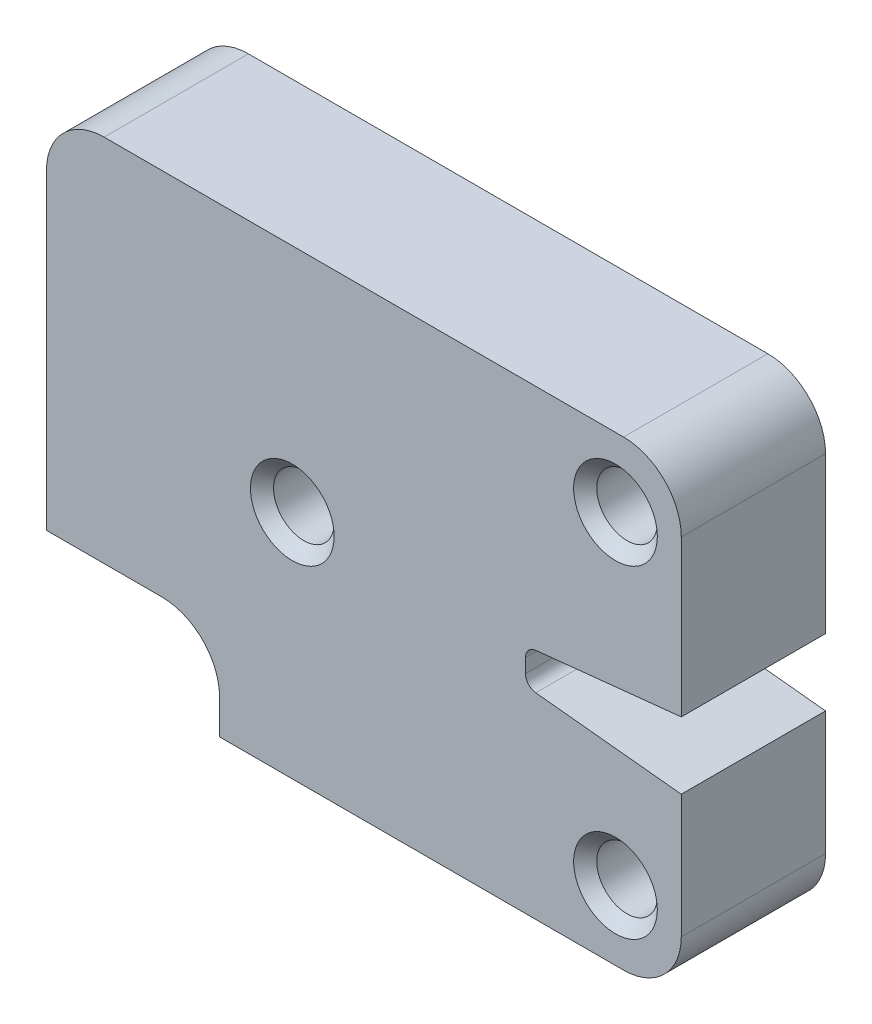
ISO-10303-21;
HEADER;
FILE_DESCRIPTION(('STEP AP214'),'2;1');
FILE_NAME('part.step','',(''),(''),'','','');
FILE_SCHEMA(('AUTOMOTIVE_DESIGN { 1 0 10303 214 1 1 1 1 }'));
ENDSEC;
DATA;
#1=APPLICATION_CONTEXT('core data for automotive mechanical design processes');
#2=APPLICATION_PROTOCOL_DEFINITION('international standard','automotive_design',2000,#1);
#3=PRODUCT_CONTEXT('',#1,'mechanical');
#4=PRODUCT('Part','Part','',(#3));
#5=PRODUCT_RELATED_PRODUCT_CATEGORY('part','',(#4));
#6=PRODUCT_DEFINITION_FORMATION('','',#4);
#7=PRODUCT_DEFINITION_CONTEXT('part definition',#1,'design');
#8=PRODUCT_DEFINITION('design','',#6,#7);
#9=PRODUCT_DEFINITION_SHAPE('','',#8);
#10=(LENGTH_UNIT() NAMED_UNIT(*) SI_UNIT(.MILLI.,.METRE.));
#11=(NAMED_UNIT(*) PLANE_ANGLE_UNIT() SI_UNIT($,.RADIAN.));
#12=(NAMED_UNIT(*) SI_UNIT($,.STERADIAN.) SOLID_ANGLE_UNIT());
#13=UNCERTAINTY_MEASURE_WITH_UNIT(LENGTH_MEASURE(1.E-05),#10,'distance_accuracy_value','');
#14=(GEOMETRIC_REPRESENTATION_CONTEXT(3) GLOBAL_UNCERTAINTY_ASSIGNED_CONTEXT((#13)) GLOBAL_UNIT_ASSIGNED_CONTEXT((#10,
#11,#12)) REPRESENTATION_CONTEXT('',''));
#15=CARTESIAN_POINT('',(0.,0.,0.));
#16=DIRECTION('',(0.,0.,1.));
#17=DIRECTION('',(1.,0.,0.));
#18=AXIS2_PLACEMENT_3D('',#15,#16,#17);
#19=CARTESIAN_POINT('',(21.8,14.,-6.25));
#20=DIRECTION('',(0.,0.,-1.));
#21=DIRECTION('',(-1.,0.,0.));
#22=AXIS2_PLACEMENT_3D('',#19,#20,#21);
#23=CONICAL_SURFACE('',#22,3.625,0.785398163397449);
#24=CARTESIAN_POINT('',(21.8,14.,-5.25));
#25=DIRECTION('',(0.,0.,-1.));
#26=DIRECTION('',(1.,0.,0.));
#27=AXIS2_PLACEMENT_3D('',#24,#25,#26);
#28=CIRCLE('',#27,2.625);
#29=CARTESIAN_POINT('',(24.425,14.,-5.25));
#30=VERTEX_POINT('',#29);
#31=EDGE_CURVE('E341',#30,#30,#28,.T.);
#32=ORIENTED_EDGE('',*,*,#31,.F.);
#33=EDGE_LOOP('',(#32));
#34=FACE_BOUND('',#33,.T.);
#35=CARTESIAN_POINT('',(21.8,14.,-6.25));
#36=DIRECTION('',(0.,0.,1.));
#37=DIRECTION('',(1.,0.,0.));
#38=AXIS2_PLACEMENT_3D('',#35,#36,#37);
#39=CIRCLE('',#38,3.625);
#40=CARTESIAN_POINT('',(25.425,14.,-6.25));
#41=VERTEX_POINT('',#40);
#42=EDGE_CURVE('E297',#41,#41,#39,.T.);
#43=ORIENTED_EDGE('',*,*,#42,.F.);
#44=EDGE_LOOP('',(#43));
#45=FACE_BOUND('',#44,.T.);
#46=ADVANCED_FACE('F16',(#34,#45),#23,.F.);
#47=CARTESIAN_POINT('',(-6.2,0.,-6.25));
#48=DIRECTION('',(0.,0.,-1.));
#49=DIRECTION('',(-1.,0.,0.));
#50=AXIS2_PLACEMENT_3D('',#47,#48,#49);
#51=CONICAL_SURFACE('',#50,3.625,0.785398163397449);
#52=CARTESIAN_POINT('',(-6.2,0.,-5.25));
#53=DIRECTION('',(0.,0.,-1.));
#54=DIRECTION('',(1.,0.,0.));
#55=AXIS2_PLACEMENT_3D('',#52,#53,#54);
#56=CIRCLE('',#55,2.625);
#57=CARTESIAN_POINT('',(-3.575,0.,-5.25));
#58=VERTEX_POINT('',#57);
#59=EDGE_CURVE('E26',#58,#58,#56,.T.);
#60=ORIENTED_EDGE('',*,*,#59,.F.);
#61=EDGE_LOOP('',(#60));
#62=FACE_BOUND('',#61,.T.);
#63=CARTESIAN_POINT('',(-6.2,0.,-6.25));
#64=DIRECTION('',(0.,0.,1.));
#65=DIRECTION('',(1.,0.,0.));
#66=AXIS2_PLACEMENT_3D('',#63,#64,#65);
#67=CIRCLE('',#66,3.625);
#68=CARTESIAN_POINT('',(-2.575,0.,-6.25));
#69=VERTEX_POINT('',#68);
#70=EDGE_CURVE('E271',#69,#69,#67,.T.);
#71=ORIENTED_EDGE('',*,*,#70,.F.);
#72=EDGE_LOOP('',(#71));
#73=FACE_BOUND('',#72,.T.);
#74=ADVANCED_FACE('F898',(#62,#73),#51,.F.);
#75=CARTESIAN_POINT('',(21.8,-14.,-6.25));
#76=DIRECTION('',(0.,0.,-1.));
#77=DIRECTION('',(-1.,0.,0.));
#78=AXIS2_PLACEMENT_3D('',#75,#76,#77);
#79=CONICAL_SURFACE('',#78,3.625,0.785398163397449);
#80=CARTESIAN_POINT('',(21.8,-14.,-5.25));
#81=DIRECTION('',(0.,0.,-1.));
#82=DIRECTION('',(1.,0.,0.));
#83=AXIS2_PLACEMENT_3D('',#80,#81,#82);
#84=CIRCLE('',#83,2.625);
#85=CARTESIAN_POINT('',(24.425,-14.,-5.25));
#86=VERTEX_POINT('',#85);
#87=EDGE_CURVE('E139',#86,#86,#84,.T.);
#88=ORIENTED_EDGE('',*,*,#87,.F.);
#89=EDGE_LOOP('',(#88));
#90=FACE_BOUND('',#89,.T.);
#91=CARTESIAN_POINT('',(21.8,-14.,-6.25));
#92=DIRECTION('',(0.,0.,1.));
#93=DIRECTION('',(1.,0.,0.));
#94=AXIS2_PLACEMENT_3D('',#91,#92,#93);
#95=CIRCLE('',#94,3.625);
#96=CARTESIAN_POINT('',(25.425,-14.,-6.25));
#97=VERTEX_POINT('',#96);
#98=EDGE_CURVE('E268',#97,#97,#95,.T.);
#99=ORIENTED_EDGE('',*,*,#98,.F.);
#100=EDGE_LOOP('',(#99));
#101=FACE_BOUND('',#100,.T.);
#102=ADVANCED_FACE('F18',(#90,#101),#79,.F.);
#103=CARTESIAN_POINT('',(21.8,-14.,5.25));
#104=DIRECTION('',(0.,0.,1.));
#105=DIRECTION('',(1.,0.,0.));
#106=AXIS2_PLACEMENT_3D('',#103,#104,#105);
#107=CONICAL_SURFACE('',#106,2.625,0.785398163397454);
#108=CARTESIAN_POINT('',(21.8,-14.,5.25));
#109=DIRECTION('',(0.,0.,1.));
#110=DIRECTION('',(1.,0.,0.));
#111=AXIS2_PLACEMENT_3D('',#108,#109,#110);
#112=CIRCLE('',#111,2.625);
#113=CARTESIAN_POINT('',(24.425,-14.,5.25));
#114=VERTEX_POINT('',#113);
#115=EDGE_CURVE('E149',#114,#114,#112,.T.);
#116=ORIENTED_EDGE('',*,*,#115,.F.);
#117=EDGE_LOOP('',(#116));
#118=FACE_BOUND('',#117,.T.);
#119=CARTESIAN_POINT('',(21.8,-14.,6.25));
#120=DIRECTION('',(0.,0.,-1.));
#121=DIRECTION('',(1.,0.,0.));
#122=AXIS2_PLACEMENT_3D('',#119,#120,#121);
#123=CIRCLE('',#122,3.625);
#124=CARTESIAN_POINT('',(25.425,-14.,6.25));
#125=VERTEX_POINT('',#124);
#126=EDGE_CURVE('E229',#125,#125,#123,.T.);
#127=ORIENTED_EDGE('',*,*,#126,.F.);
#128=EDGE_LOOP('',(#127));
#129=FACE_BOUND('',#128,.T.);
#130=ADVANCED_FACE('F1085',(#118,#129),#107,.F.);
#131=CARTESIAN_POINT('',(21.8,14.,5.25));
#132=DIRECTION('',(0.,0.,1.));
#133=DIRECTION('',(1.,0.,0.));
#134=AXIS2_PLACEMENT_3D('',#131,#132,#133);
#135=CONICAL_SURFACE('',#134,2.625,0.785398163397454);
#136=CARTESIAN_POINT('',(21.8,14.,5.25));
#137=DIRECTION('',(0.,0.,1.));
#138=DIRECTION('',(1.,0.,0.));
#139=AXIS2_PLACEMENT_3D('',#136,#137,#138);
#140=CIRCLE('',#139,2.625);
#141=CARTESIAN_POINT('',(24.425,14.,5.25));
#142=VERTEX_POINT('',#141);
#143=EDGE_CURVE('E344',#142,#142,#140,.T.);
#144=ORIENTED_EDGE('',*,*,#143,.F.);
#145=EDGE_LOOP('',(#144));
#146=FACE_BOUND('',#145,.T.);
#147=CARTESIAN_POINT('',(21.8,14.,6.25));
#148=DIRECTION('',(0.,0.,-1.));
#149=DIRECTION('',(1.,0.,0.));
#150=AXIS2_PLACEMENT_3D('',#147,#148,#149);
#151=CIRCLE('',#150,3.625);
#152=CARTESIAN_POINT('',(25.425,14.,6.25));
#153=VERTEX_POINT('',#152);
#154=EDGE_CURVE('E226',#153,#153,#151,.T.);
#155=ORIENTED_EDGE('',*,*,#154,.F.);
#156=EDGE_LOOP('',(#155));
#157=FACE_BOUND('',#156,.T.);
#158=ADVANCED_FACE('F1076',(#146,#157),#135,.F.);
#159=CARTESIAN_POINT('',(-6.2,0.,5.25));
#160=DIRECTION('',(0.,0.,1.));
#161=DIRECTION('',(1.,0.,0.));
#162=AXIS2_PLACEMENT_3D('',#159,#160,#161);
#163=CONICAL_SURFACE('',#162,2.625,0.78539816339745);
#164=CARTESIAN_POINT('',(-6.2,0.,5.25));
#165=DIRECTION('',(0.,0.,1.));
#166=DIRECTION('',(1.,0.,0.));
#167=AXIS2_PLACEMENT_3D('',#164,#165,#166);
#168=CIRCLE('',#167,2.625);
#169=CARTESIAN_POINT('',(-3.575,0.,5.25));
#170=VERTEX_POINT('',#169);
#171=EDGE_CURVE('E10',#170,#170,#168,.T.);
#172=ORIENTED_EDGE('',*,*,#171,.F.);
#173=EDGE_LOOP('',(#172));
#174=FACE_BOUND('',#173,.T.);
#175=CARTESIAN_POINT('',(-6.2,0.,6.25));
#176=DIRECTION('',(0.,0.,-1.));
#177=DIRECTION('',(1.,0.,0.));
#178=AXIS2_PLACEMENT_3D('',#175,#176,#177);
#179=CIRCLE('',#178,3.625);
#180=CARTESIAN_POINT('',(-2.575,0.,6.25));
#181=VERTEX_POINT('',#180);
#182=EDGE_CURVE('E208',#181,#181,#179,.T.);
#183=ORIENTED_EDGE('',*,*,#182,.F.);
#184=EDGE_LOOP('',(#183));
#185=FACE_BOUND('',#184,.T.);
#186=ADVANCED_FACE('F1067',(#174,#185),#163,.F.);
#187=CARTESIAN_POINT('',(22.5,15.,6.25));
#188=DIRECTION('',(0.,0.,-1.));
#189=DIRECTION('',(-1.,0.,0.));
#190=AXIS2_PLACEMENT_3D('',#187,#188,#189);
#191=CYLINDRICAL_SURFACE('',#190,5.);
#192=CARTESIAN_POINT('',(22.5,15.,6.25));
#193=DIRECTION('',(0.,0.,1.));
#194=DIRECTION('',(1.,0.,0.));
#195=AXIS2_PLACEMENT_3D('',#192,#193,#194);
#196=CIRCLE('',#195,5.);
#197=CARTESIAN_POINT('',(27.5,15.,6.25));
#198=VERTEX_POINT('',#197);
#199=CARTESIAN_POINT('',(22.5,20.,6.25));
#200=VERTEX_POINT('',#199);
#201=EDGE_CURVE('E378',#198,#200,#196,.T.);
#202=ORIENTED_EDGE('',*,*,#201,.F.);
#203=DIRECTION('',(0.,0.,1.));
#204=VECTOR('',#203,1.);
#205=CARTESIAN_POINT('',(27.5,15.,6.25));
#206=LINE('',#205,#204);
#207=CARTESIAN_POINT('',(27.5,15.,-6.25));
#208=VERTEX_POINT('',#207);
#209=EDGE_CURVE('E304',#208,#198,#206,.T.);
#210=ORIENTED_EDGE('',*,*,#209,.F.);
#211=CARTESIAN_POINT('',(22.5,15.,-6.25));
#212=DIRECTION('',(0.,0.,-1.));
#213=DIRECTION('',(1.,0.,0.));
#214=AXIS2_PLACEMENT_3D('',#211,#212,#213);
#215=CIRCLE('',#214,5.);
#216=CARTESIAN_POINT('',(22.5,20.,-6.25));
#217=VERTEX_POINT('',#216);
#218=EDGE_CURVE('E263',#217,#208,#215,.T.);
#219=ORIENTED_EDGE('',*,*,#218,.F.);
#220=DIRECTION('',(0.,0.,-1.));
#221=VECTOR('',#220,1.);
#222=CARTESIAN_POINT('',(22.5,20.,6.25));
#223=LINE('',#222,#221);
#224=EDGE_CURVE('E338',#200,#217,#223,.T.);
#225=ORIENTED_EDGE('',*,*,#224,.F.);
#226=EDGE_LOOP('',(#202,#210,#219,#225));
#227=FACE_BOUND('',#226,.T.);
#228=ADVANCED_FACE('F1059',(#227),#191,.T.);
#229=CARTESIAN_POINT('',(-22.5,15.,6.25));
#230=DIRECTION('',(0.,0.,-1.));
#231=DIRECTION('',(-1.,0.,0.));
#232=AXIS2_PLACEMENT_3D('',#229,#230,#231);
#233=CYLINDRICAL_SURFACE('',#232,5.);
#234=CARTESIAN_POINT('',(-22.5,15.,6.25));
#235=DIRECTION('',(0.,0.,1.));
#236=DIRECTION('',(1.,0.,0.));
#237=AXIS2_PLACEMENT_3D('',#234,#235,#236);
#238=CIRCLE('',#237,5.);
#239=CARTESIAN_POINT('',(-22.5,20.,6.25));
#240=VERTEX_POINT('',#239);
#241=CARTESIAN_POINT('',(-27.5,15.,6.25));
#242=VERTEX_POINT('',#241);
#243=EDGE_CURVE('E366',#240,#242,#238,.T.);
#244=ORIENTED_EDGE('',*,*,#243,.F.);
#245=DIRECTION('',(0.,0.,1.));
#246=VECTOR('',#245,1.);
#247=CARTESIAN_POINT('',(-22.5,20.,6.25));
#248=LINE('',#247,#246);
#249=CARTESIAN_POINT('',(-22.5,20.,-6.25));
#250=VERTEX_POINT('',#249);
#251=EDGE_CURVE('E307',#250,#240,#248,.T.);
#252=ORIENTED_EDGE('',*,*,#251,.F.);
#253=CARTESIAN_POINT('',(-22.5,15.,-6.25));
#254=DIRECTION('',(0.,0.,-1.));
#255=DIRECTION('',(1.,0.,0.));
#256=AXIS2_PLACEMENT_3D('',#253,#254,#255);
#257=CIRCLE('',#256,5.);
#258=CARTESIAN_POINT('',(-27.5,15.,-6.25));
#259=VERTEX_POINT('',#258);
#260=EDGE_CURVE('E255',#259,#250,#257,.T.);
#261=ORIENTED_EDGE('',*,*,#260,.F.);
#262=DIRECTION('',(0.,0.,-1.));
#263=VECTOR('',#262,1.);
#264=CARTESIAN_POINT('',(-27.5,15.,6.25));
#265=LINE('',#264,#263);
#266=EDGE_CURVE('E300',#242,#259,#265,.T.);
#267=ORIENTED_EDGE('',*,*,#266,.F.);
#268=EDGE_LOOP('',(#244,#252,#261,#267));
#269=FACE_BOUND('',#268,.T.);
#270=ADVANCED_FACE('F623',(#269),#233,.T.);
#271=CARTESIAN_POINT('',(22.5,-15.,6.25));
#272=DIRECTION('',(0.,0.,-1.));
#273=DIRECTION('',(-1.,0.,0.));
#274=AXIS2_PLACEMENT_3D('',#271,#272,#273);
#275=CYLINDRICAL_SURFACE('',#274,5.);
#276=CARTESIAN_POINT('',(22.5,-15.,6.25));
#277=DIRECTION('',(0.,0.,1.));
#278=DIRECTION('',(1.,0.,0.));
#279=AXIS2_PLACEMENT_3D('',#276,#277,#278);
#280=CIRCLE('',#279,5.);
#281=CARTESIAN_POINT('',(22.5,-20.,6.25));
#282=VERTEX_POINT('',#281);
#283=CARTESIAN_POINT('',(27.5,-15.,6.25));
#284=VERTEX_POINT('',#283);
#285=EDGE_CURVE('E396',#282,#284,#280,.T.);
#286=ORIENTED_EDGE('',*,*,#285,.F.);
#287=DIRECTION('',(0.,0.,1.));
#288=VECTOR('',#287,1.);
#289=CARTESIAN_POINT('',(22.5,-20.,6.25));
#290=LINE('',#289,#288);
#291=CARTESIAN_POINT('',(22.5,-20.,-6.25));
#292=VERTEX_POINT('',#291);
#293=EDGE_CURVE('E313',#292,#282,#290,.T.);
#294=ORIENTED_EDGE('',*,*,#293,.F.);
#295=CARTESIAN_POINT('',(22.5,-15.,-6.25));
#296=DIRECTION('',(0.,0.,-1.));
#297=DIRECTION('',(1.,0.,0.));
#298=AXIS2_PLACEMENT_3D('',#295,#296,#297);
#299=CIRCLE('',#298,5.);
#300=CARTESIAN_POINT('',(27.5,-15.,-6.25));
#301=VERTEX_POINT('',#300);
#302=EDGE_CURVE('E236',#301,#292,#299,.T.);
#303=ORIENTED_EDGE('',*,*,#302,.F.);
#304=DIRECTION('',(0.,0.,-1.));
#305=VECTOR('',#304,1.);
#306=CARTESIAN_POINT('',(27.5,-15.,6.25));
#307=LINE('',#306,#305);
#308=EDGE_CURVE('E317',#284,#301,#307,.T.);
#309=ORIENTED_EDGE('',*,*,#308,.F.);
#310=EDGE_LOOP('',(#286,#294,#303,#309));
#311=FACE_BOUND('',#310,.T.);
#312=ADVANCED_FACE('F939',(#311),#275,.T.);
#313=CARTESIAN_POINT('',(-17.5,-17.,6.25));
#314=DIRECTION('',(0.,0.,1.));
#315=DIRECTION('',(1.,0.,0.));
#316=AXIS2_PLACEMENT_3D('',#313,#314,#315);
#317=CYLINDRICAL_SURFACE('',#316,5.);
#318=CARTESIAN_POINT('',(-17.5,-17.,6.25));
#319=DIRECTION('',(0.,0.,-1.));
#320=DIRECTION('',(1.,0.,0.));
#321=AXIS2_PLACEMENT_3D('',#318,#319,#320);
#322=CIRCLE('',#321,5.);
#323=CARTESIAN_POINT('',(-17.5,-12.,6.25));
#324=VERTEX_POINT('',#323);
#325=CARTESIAN_POINT('',(-12.5,-17.,6.25));
#326=VERTEX_POINT('',#325);
#327=EDGE_CURVE('E188',#324,#326,#322,.T.);
#328=ORIENTED_EDGE('',*,*,#327,.F.);
#329=DIRECTION('',(0.,0.,1.));
#330=VECTOR('',#329,1.);
#331=CARTESIAN_POINT('',(-17.5,-12.,6.25));
#332=LINE('',#331,#330);
#333=CARTESIAN_POINT('',(-17.5,-12.,-6.25));
#334=VERTEX_POINT('',#333);
#335=EDGE_CURVE('E197',#334,#324,#332,.T.);
#336=ORIENTED_EDGE('',*,*,#335,.F.);
#337=CARTESIAN_POINT('',(-17.5,-17.,-6.25));
#338=DIRECTION('',(0.,0.,1.));
#339=DIRECTION('',(1.,0.,0.));
#340=AXIS2_PLACEMENT_3D('',#337,#338,#339);
#341=CIRCLE('',#340,5.);
#342=CARTESIAN_POINT('',(-12.5,-17.,-6.25));
#343=VERTEX_POINT('',#342);
#344=EDGE_CURVE('E191',#343,#334,#341,.T.);
#345=ORIENTED_EDGE('',*,*,#344,.F.);
#346=DIRECTION('',(0.,0.,-1.));
#347=VECTOR('',#346,1.);
#348=CARTESIAN_POINT('',(-12.5,-17.,-6.25));
#349=LINE('',#348,#347);
#350=EDGE_CURVE('E184',#326,#343,#349,.T.);
#351=ORIENTED_EDGE('',*,*,#350,.F.);
#352=EDGE_LOOP('',(#328,#336,#345,#351));
#353=FACE_BOUND('',#352,.T.);
#354=ADVANCED_FACE('F186',(#353),#317,.F.);
#355=CARTESIAN_POINT('',(-6.2,0.,6.25));
#356=DIRECTION('',(0.,0.,-1.));
#357=DIRECTION('',(-1.,0.,0.));
#358=AXIS2_PLACEMENT_3D('',#355,#356,#357);
#359=CYLINDRICAL_SURFACE('',#358,2.625);
#360=ORIENTED_EDGE('',*,*,#171,.T.);
#361=EDGE_LOOP('',(#360));
#362=FACE_BOUND('',#361,.T.);
#363=ORIENTED_EDGE('',*,*,#59,.T.);
#364=EDGE_LOOP('',(#363));
#365=FACE_BOUND('',#364,.T.);
#366=ADVANCED_FACE('F1037',(#362,#365),#359,.F.);
#367=CARTESIAN_POINT('',(21.8,-14.,6.25));
#368=DIRECTION('',(0.,0.,-1.));
#369=DIRECTION('',(-1.,0.,0.));
#370=AXIS2_PLACEMENT_3D('',#367,#368,#369);
#371=CYLINDRICAL_SURFACE('',#370,2.625);
#372=ORIENTED_EDGE('',*,*,#115,.T.);
#373=EDGE_LOOP('',(#372));
#374=FACE_BOUND('',#373,.T.);
#375=ORIENTED_EDGE('',*,*,#87,.T.);
#376=EDGE_LOOP('',(#375));
#377=FACE_BOUND('',#376,.T.);
#378=ADVANCED_FACE('F966',(#374,#377),#371,.F.);
#379=CARTESIAN_POINT('',(21.8,14.,6.25));
#380=DIRECTION('',(0.,0.,-1.));
#381=DIRECTION('',(-1.,0.,0.));
#382=AXIS2_PLACEMENT_3D('',#379,#380,#381);
#383=CYLINDRICAL_SURFACE('',#382,2.625);
#384=ORIENTED_EDGE('',*,*,#143,.T.);
#385=EDGE_LOOP('',(#384));
#386=FACE_BOUND('',#385,.T.);
#387=ORIENTED_EDGE('',*,*,#31,.T.);
#388=EDGE_LOOP('',(#387));
#389=FACE_BOUND('',#388,.T.);
#390=ADVANCED_FACE('F961',(#386,#389),#383,.F.);
#391=CARTESIAN_POINT('',(-27.5,20.,6.25));
#392=DIRECTION('',(0.,-1.,0.));
#393=DIRECTION('',(0.,0.,-1.));
#394=AXIS2_PLACEMENT_3D('',#391,#392,#393);
#395=PLANE('',#394);
#396=DIRECTION('',(-1.,0.,0.));
#397=VECTOR('',#396,1.);
#398=CARTESIAN_POINT('',(-27.5,20.,-6.25));
#399=LINE('',#398,#397);
#400=EDGE_CURVE('E259',#217,#250,#399,.T.);
#401=ORIENTED_EDGE('',*,*,#400,.T.);
#402=ORIENTED_EDGE('',*,*,#251,.T.);
#403=DIRECTION('',(-1.,0.,0.));
#404=VECTOR('',#403,1.);
#405=CARTESIAN_POINT('',(-27.5,20.,6.25));
#406=LINE('',#405,#404);
#407=EDGE_CURVE('E384',#200,#240,#406,.T.);
#408=ORIENTED_EDGE('',*,*,#407,.F.);
#409=ORIENTED_EDGE('',*,*,#224,.T.);
#410=EDGE_LOOP('',(#401,#402,#408,#409));
#411=FACE_BOUND('',#410,.T.);
#412=ADVANCED_FACE('F965',(#411),#395,.F.);
#413=CARTESIAN_POINT('',(27.5,20.,6.25));
#414=DIRECTION('',(-1.,0.,0.));
#415=DIRECTION('',(0.,0.,1.));
#416=AXIS2_PLACEMENT_3D('',#413,#414,#415);
#417=PLANE('',#416);
#418=DIRECTION('',(0.,1.,0.));
#419=VECTOR('',#418,1.);
#420=CARTESIAN_POINT('',(27.5,20.,-6.25));
#421=LINE('',#420,#419);
#422=CARTESIAN_POINT('',(27.5,1.5,-6.25));
#423=VERTEX_POINT('',#422);
#424=EDGE_CURVE('E267',#423,#208,#421,.T.);
#425=ORIENTED_EDGE('',*,*,#424,.T.);
#426=ORIENTED_EDGE('',*,*,#209,.T.);
#427=DIRECTION('',(0.,1.,0.));
#428=VECTOR('',#427,1.);
#429=CARTESIAN_POINT('',(27.5,20.,6.25));
#430=LINE('',#429,#428);
#431=CARTESIAN_POINT('',(27.5,1.5,6.25));
#432=VERTEX_POINT('',#431);
#433=EDGE_CURVE('E375',#432,#198,#430,.T.);
#434=ORIENTED_EDGE('',*,*,#433,.F.);
#435=DIRECTION('',(0.,0.,-1.));
#436=VECTOR('',#435,1.);
#437=CARTESIAN_POINT('',(27.5,1.5,6.25));
#438=LINE('',#437,#436);
#439=EDGE_CURVE('E308',#432,#423,#438,.T.);
#440=ORIENTED_EDGE('',*,*,#439,.T.);
#441=EDGE_LOOP('',(#425,#426,#434,#440));
#442=FACE_BOUND('',#441,.T.);
#443=ADVANCED_FACE('F986',(#442),#417,.F.);
#444=CARTESIAN_POINT('',(27.5,1.5,6.25));
#445=DIRECTION('',(-0.103150523023816,0.994665757729657,0.));
#446=DIRECTION('',(0.,0.,1.));
#447=AXIS2_PLACEMENT_3D('',#444,#445,#446);
#448=PLANE('',#447);
#449=DIRECTION('',(0.994665757729657,0.103150523023816,0.));
#450=VECTOR('',#449,1.);
#451=CARTESIAN_POINT('',(27.5,1.5,-6.25));
#452=LINE('',#451,#450);
#453=CARTESIAN_POINT('',(14.8968494769762,0.193006612427165,-6.25));
#454=VERTEX_POINT('',#453);
#455=EDGE_CURVE('E276',#454,#423,#452,.T.);
#456=ORIENTED_EDGE('',*,*,#455,.T.);
#457=ORIENTED_EDGE('',*,*,#439,.F.);
#458=DIRECTION('',(0.994665757729657,0.103150523023816,0.));
#459=VECTOR('',#458,1.);
#460=CARTESIAN_POINT('',(27.5,1.5,6.25));
#461=LINE('',#460,#459);
#462=CARTESIAN_POINT('',(14.8968494769762,0.193006612427165,6.25));
#463=VERTEX_POINT('',#462);
#464=EDGE_CURVE('E370',#463,#432,#461,.T.);
#465=ORIENTED_EDGE('',*,*,#464,.F.);
#466=DIRECTION('',(0.,0.,-1.));
#467=VECTOR('',#466,1.);
#468=CARTESIAN_POINT('',(14.8968494769762,0.193006612427165,6.25));
#469=LINE('',#468,#467);
#470=EDGE_CURVE('E331',#463,#454,#469,.T.);
#471=ORIENTED_EDGE('',*,*,#470,.T.);
#472=EDGE_LOOP('',(#456,#457,#465,#471));
#473=FACE_BOUND('',#472,.T.);
#474=ADVANCED_FACE('F990',(#473),#448,.F.);
#475=CARTESIAN_POINT('',(15.,-0.801659145302492,6.25));
#476=DIRECTION('',(0.,0.,-1.));
#477=DIRECTION('',(-1.,0.,0.));
#478=AXIS2_PLACEMENT_3D('',#475,#476,#477);
#479=CYLINDRICAL_SURFACE('',#478,1.);
#480=CARTESIAN_POINT('',(15.,-0.801659145302492,-6.25));
#481=DIRECTION('',(0.,0.,-1.));
#482=DIRECTION('',(-1.,0.,0.));
#483=AXIS2_PLACEMENT_3D('',#480,#481,#482);
#484=CIRCLE('',#483,1.);
#485=CARTESIAN_POINT('',(14.,-0.801659145302492,-6.25));
#486=VERTEX_POINT('',#485);
#487=EDGE_CURVE('E280',#486,#454,#484,.T.);
#488=ORIENTED_EDGE('',*,*,#487,.T.);
#489=ORIENTED_EDGE('',*,*,#470,.F.);
#490=CARTESIAN_POINT('',(15.,-0.801659145302492,6.25));
#491=DIRECTION('',(0.,0.,-1.));
#492=DIRECTION('',(-1.,0.,0.));
#493=AXIS2_PLACEMENT_3D('',#490,#491,#492);
#494=CIRCLE('',#493,1.);
#495=CARTESIAN_POINT('',(14.,-0.801659145302492,6.25));
#496=VERTEX_POINT('',#495);
#497=EDGE_CURVE('E363',#496,#463,#494,.T.);
#498=ORIENTED_EDGE('',*,*,#497,.F.);
#499=DIRECTION('',(0.,0.,-1.));
#500=VECTOR('',#499,1.);
#501=CARTESIAN_POINT('',(14.,-0.801659145302492,6.25));
#502=LINE('',#501,#500);
#503=EDGE_CURVE('E330',#496,#486,#502,.T.);
#504=ORIENTED_EDGE('',*,*,#503,.T.);
#505=EDGE_LOOP('',(#488,#489,#498,#504));
#506=FACE_BOUND('',#505,.T.);
#507=ADVANCED_FACE('F648',(#506),#479,.F.);
#508=CARTESIAN_POINT('',(14.,-0.801659145302492,6.25));
#509=DIRECTION('',(-1.,0.,0.));
#510=DIRECTION('',(0.,0.,1.));
#511=AXIS2_PLACEMENT_3D('',#508,#509,#510);
#512=PLANE('',#511);
#513=DIRECTION('',(0.,1.,0.));
#514=VECTOR('',#513,1.);
#515=CARTESIAN_POINT('',(14.,-0.801659145302492,-6.25));
#516=LINE('',#515,#514);
#517=CARTESIAN_POINT('',(14.,-1.9983408546975,-6.25));
#518=VERTEX_POINT('',#517);
#519=EDGE_CURVE('E284',#518,#486,#516,.T.);
#520=ORIENTED_EDGE('',*,*,#519,.T.);
#521=ORIENTED_EDGE('',*,*,#503,.F.);
#522=DIRECTION('',(0.,1.,0.));
#523=VECTOR('',#522,1.);
#524=CARTESIAN_POINT('',(14.,-0.801659145302492,6.25));
#525=LINE('',#524,#523);
#526=CARTESIAN_POINT('',(14.,-1.9983408546975,6.25));
#527=VERTEX_POINT('',#526);
#528=EDGE_CURVE('E359',#527,#496,#525,.T.);
#529=ORIENTED_EDGE('',*,*,#528,.F.);
#530=DIRECTION('',(0.,0.,-1.));
#531=VECTOR('',#530,1.);
#532=CARTESIAN_POINT('',(14.,-1.9983408546975,6.25));
#533=LINE('',#532,#531);
#534=EDGE_CURVE('E327',#527,#518,#533,.T.);
#535=ORIENTED_EDGE('',*,*,#534,.T.);
#536=EDGE_LOOP('',(#520,#521,#529,#535));
#537=FACE_BOUND('',#536,.T.);
#538=ADVANCED_FACE('F644',(#537),#512,.F.);
#539=CARTESIAN_POINT('',(15.,-1.9983408546975,6.25));
#540=DIRECTION('',(0.,0.,-1.));
#541=DIRECTION('',(-1.,0.,0.));
#542=AXIS2_PLACEMENT_3D('',#539,#540,#541);
#543=CYLINDRICAL_SURFACE('',#542,1.);
#544=CARTESIAN_POINT('',(15.,-1.9983408546975,-6.25));
#545=DIRECTION('',(0.,0.,-1.));
#546=DIRECTION('',(1.,0.,0.));
#547=AXIS2_PLACEMENT_3D('',#544,#545,#546);
#548=CIRCLE('',#547,1.);
#549=CARTESIAN_POINT('',(14.8968494769762,-2.99300661242716,-6.25));
#550=VERTEX_POINT('',#549);
#551=EDGE_CURVE('E288',#550,#518,#548,.T.);
#552=ORIENTED_EDGE('',*,*,#551,.T.);
#553=ORIENTED_EDGE('',*,*,#534,.F.);
#554=CARTESIAN_POINT('',(15.,-1.9983408546975,6.25));
#555=DIRECTION('',(0.,0.,-1.));
#556=DIRECTION('',(1.,0.,0.));
#557=AXIS2_PLACEMENT_3D('',#554,#555,#556);
#558=CIRCLE('',#557,1.);
#559=CARTESIAN_POINT('',(14.8968494769762,-2.99300661242716,6.25));
#560=VERTEX_POINT('',#559);
#561=EDGE_CURVE('E357',#560,#527,#558,.T.);
#562=ORIENTED_EDGE('',*,*,#561,.F.);
#563=DIRECTION('',(0.,0.,-1.));
#564=VECTOR('',#563,1.);
#565=CARTESIAN_POINT('',(14.8968494769762,-2.99300661242716,6.25));
#566=LINE('',#565,#564);
#567=EDGE_CURVE('E324',#560,#550,#566,.T.);
#568=ORIENTED_EDGE('',*,*,#567,.T.);
#569=EDGE_LOOP('',(#552,#553,#562,#568));
#570=FACE_BOUND('',#569,.T.);
#571=ADVANCED_FACE('F919',(#570),#543,.F.);
#572=CARTESIAN_POINT('',(14.8968494769762,-2.99300661242716,6.25));
#573=DIRECTION('',(-0.103150523023816,-0.994665757729657,0.));
#574=DIRECTION('',(-0.994665757729657,0.103150523023816,0.));
#575=AXIS2_PLACEMENT_3D('',#572,#573,#574);
#576=PLANE('',#575);
#577=DIRECTION('',(-0.994665757729657,0.103150523023816,0.));
#578=VECTOR('',#577,1.);
#579=CARTESIAN_POINT('',(14.8968494769762,-2.99300661242716,-6.25));
#580=LINE('',#579,#578);
#581=CARTESIAN_POINT('',(27.5,-4.3,-6.25));
#582=VERTEX_POINT('',#581);
#583=EDGE_CURVE('E272',#582,#550,#580,.T.);
#584=ORIENTED_EDGE('',*,*,#583,.T.);
#585=ORIENTED_EDGE('',*,*,#567,.F.);
#586=DIRECTION('',(-0.994665757729657,0.103150523023816,0.));
#587=VECTOR('',#586,1.);
#588=CARTESIAN_POINT('',(14.8968494769762,-2.99300661242716,6.25));
#589=LINE('',#588,#587);
#590=CARTESIAN_POINT('',(27.5,-4.3,6.25));
#591=VERTEX_POINT('',#590);
#592=EDGE_CURVE('E397',#591,#560,#589,.T.);
#593=ORIENTED_EDGE('',*,*,#592,.F.);
#594=DIRECTION('',(0.,0.,-1.));
#595=VECTOR('',#594,1.);
#596=CARTESIAN_POINT('',(27.5,-4.3,6.25));
#597=LINE('',#596,#595);
#598=EDGE_CURVE('E321',#591,#582,#597,.T.);
#599=ORIENTED_EDGE('',*,*,#598,.T.);
#600=EDGE_LOOP('',(#584,#585,#593,#599));
#601=FACE_BOUND('',#600,.T.);
#602=ADVANCED_FACE('F915',(#601),#576,.F.);
#603=CARTESIAN_POINT('',(27.5,-4.3,6.25));
#604=DIRECTION('',(-1.,0.,0.));
#605=DIRECTION('',(0.,1.,0.));
#606=AXIS2_PLACEMENT_3D('',#603,#604,#605);
#607=PLANE('',#606);
#608=DIRECTION('',(0.,1.,0.));
#609=VECTOR('',#608,1.);
#610=CARTESIAN_POINT('',(27.5,-4.3,6.25));
#611=LINE('',#610,#609);
#612=EDGE_CURVE('E401',#284,#591,#611,.T.);
#613=ORIENTED_EDGE('',*,*,#612,.F.);
#614=ORIENTED_EDGE('',*,*,#308,.T.);
#615=DIRECTION('',(0.,1.,0.));
#616=VECTOR('',#615,1.);
#617=CARTESIAN_POINT('',(27.5,-4.3,-6.25));
#618=LINE('',#617,#616);
#619=EDGE_CURVE('E232',#301,#582,#618,.T.);
#620=ORIENTED_EDGE('',*,*,#619,.T.);
#621=ORIENTED_EDGE('',*,*,#598,.F.);
#622=EDGE_LOOP('',(#613,#614,#620,#621));
#623=FACE_BOUND('',#622,.T.);
#624=ADVANCED_FACE('F426',(#623),#607,.F.);
#625=CARTESIAN_POINT('',(-12.5,-20.,6.25));
#626=DIRECTION('',(0.,1.,0.));
#627=DIRECTION('',(1.,0.,0.));
#628=AXIS2_PLACEMENT_3D('',#625,#626,#627);
#629=PLANE('',#628);
#630=DIRECTION('',(1.,0.,0.));
#631=VECTOR('',#630,1.);
#632=CARTESIAN_POINT('',(-12.5,-20.,-6.25));
#633=LINE('',#632,#631);
#634=CARTESIAN_POINT('',(-12.5,-20.,-6.25));
#635=VERTEX_POINT('',#634);
#636=EDGE_CURVE('E240',#635,#292,#633,.T.);
#637=ORIENTED_EDGE('',*,*,#636,.T.);
#638=ORIENTED_EDGE('',*,*,#293,.T.);
#639=DIRECTION('',(1.,0.,0.));
#640=VECTOR('',#639,1.);
#641=CARTESIAN_POINT('',(-12.5,-20.,6.25));
#642=LINE('',#641,#640);
#643=CARTESIAN_POINT('',(-12.5,-20.,6.25));
#644=VERTEX_POINT('',#643);
#645=EDGE_CURVE('E393',#644,#282,#642,.T.);
#646=ORIENTED_EDGE('',*,*,#645,.F.);
#647=DIRECTION('',(0.,0.,-1.));
#648=VECTOR('',#647,1.);
#649=CARTESIAN_POINT('',(-12.5,-20.,6.25));
#650=LINE('',#649,#648);
#651=EDGE_CURVE('E196',#644,#635,#650,.T.);
#652=ORIENTED_EDGE('',*,*,#651,.T.);
#653=EDGE_LOOP('',(#637,#638,#646,#652));
#654=FACE_BOUND('',#653,.T.);
#655=ADVANCED_FACE('F631',(#654),#629,.F.);
#656=CARTESIAN_POINT('',(-12.5,-12.,6.25));
#657=DIRECTION('',(1.,0.,0.));
#658=DIRECTION('',(0.,1.,0.));
#659=AXIS2_PLACEMENT_3D('',#656,#657,#658);
#660=PLANE('',#659);
#661=DIRECTION('',(0.,-1.,0.));
#662=VECTOR('',#661,1.);
#663=CARTESIAN_POINT('',(-12.5,-12.,6.25));
#664=LINE('',#663,#662);
#665=EDGE_CURVE('E201',#326,#644,#664,.T.);
#666=ORIENTED_EDGE('',*,*,#665,.F.);
#667=ORIENTED_EDGE('',*,*,#350,.T.);
#668=DIRECTION('',(0.,-1.,0.));
#669=VECTOR('',#668,1.);
#670=CARTESIAN_POINT('',(-12.5,-12.,-6.25));
#671=LINE('',#670,#669);
#672=EDGE_CURVE('E244',#343,#635,#671,.T.);
#673=ORIENTED_EDGE('',*,*,#672,.T.);
#674=ORIENTED_EDGE('',*,*,#651,.F.);
#675=EDGE_LOOP('',(#666,#667,#673,#674));
#676=FACE_BOUND('',#675,.T.);
#677=ADVANCED_FACE('F202',(#676),#660,.F.);
#678=CARTESIAN_POINT('',(-27.5,-12.,6.25));
#679=DIRECTION('',(0.,1.,0.));
#680=DIRECTION('',(1.,0.,0.));
#681=AXIS2_PLACEMENT_3D('',#678,#679,#680);
#682=PLANE('',#681);
#683=DIRECTION('',(1.,0.,0.));
#684=VECTOR('',#683,1.);
#685=CARTESIAN_POINT('',(-27.5,-12.,-6.25));
#686=LINE('',#685,#684);
#687=CARTESIAN_POINT('',(-27.5,-12.,-6.25));
#688=VERTEX_POINT('',#687);
#689=EDGE_CURVE('E247',#688,#334,#686,.T.);
#690=ORIENTED_EDGE('',*,*,#689,.T.);
#691=ORIENTED_EDGE('',*,*,#335,.T.);
#692=DIRECTION('',(1.,0.,0.));
#693=VECTOR('',#692,1.);
#694=CARTESIAN_POINT('',(-27.5,-12.,6.25));
#695=LINE('',#694,#693);
#696=CARTESIAN_POINT('',(-27.5,-12.,6.25));
#697=VERTEX_POINT('',#696);
#698=EDGE_CURVE('E213',#697,#324,#695,.T.);
#699=ORIENTED_EDGE('',*,*,#698,.F.);
#700=DIRECTION('',(0.,0.,-1.));
#701=VECTOR('',#700,1.);
#702=CARTESIAN_POINT('',(-27.5,-12.,6.25));
#703=LINE('',#702,#701);
#704=EDGE_CURVE('E301',#697,#688,#703,.T.);
#705=ORIENTED_EDGE('',*,*,#704,.T.);
#706=EDGE_LOOP('',(#690,#691,#699,#705));
#707=FACE_BOUND('',#706,.T.);
#708=ADVANCED_FACE('F619',(#707),#682,.F.);
#709=CARTESIAN_POINT('',(-27.5,20.,6.25));
#710=DIRECTION('',(1.,0.,0.));
#711=DIRECTION('',(0.,1.,0.));
#712=AXIS2_PLACEMENT_3D('',#709,#710,#711);
#713=PLANE('',#712);
#714=DIRECTION('',(0.,-1.,0.));
#715=VECTOR('',#714,1.);
#716=CARTESIAN_POINT('',(-27.5,20.,6.25));
#717=LINE('',#716,#715);
#718=EDGE_CURVE('E220',#242,#697,#717,.T.);
#719=ORIENTED_EDGE('',*,*,#718,.F.);
#720=ORIENTED_EDGE('',*,*,#266,.T.);
#721=DIRECTION('',(0.,-1.,0.));
#722=VECTOR('',#721,1.);
#723=CARTESIAN_POINT('',(-27.5,20.,-6.25));
#724=LINE('',#723,#722);
#725=EDGE_CURVE('E251',#259,#688,#724,.T.);
#726=ORIENTED_EDGE('',*,*,#725,.T.);
#727=ORIENTED_EDGE('',*,*,#704,.F.);
#728=EDGE_LOOP('',(#719,#720,#726,#727));
#729=FACE_BOUND('',#728,.T.);
#730=ADVANCED_FACE('F615',(#729),#713,.F.);
#731=CARTESIAN_POINT('',(15.,-1.9983408546975,-6.25));
#732=DIRECTION('',(0.,0.,1.));
#733=DIRECTION('',(1.,0.,0.));
#734=AXIS2_PLACEMENT_3D('',#731,#732,#733);
#735=PLANE('',#734);
#736=ORIENTED_EDGE('',*,*,#42,.T.);
#737=EDGE_LOOP('',(#736));
#738=FACE_BOUND('',#737,.T.);
#739=ORIENTED_EDGE('',*,*,#70,.T.);
#740=EDGE_LOOP('',(#739));
#741=FACE_BOUND('',#740,.T.);
#742=ORIENTED_EDGE('',*,*,#98,.T.);
#743=EDGE_LOOP('',(#742));
#744=FACE_BOUND('',#743,.T.);
#745=ORIENTED_EDGE('',*,*,#619,.F.);
#746=ORIENTED_EDGE('',*,*,#302,.T.);
#747=ORIENTED_EDGE('',*,*,#636,.F.);
#748=ORIENTED_EDGE('',*,*,#672,.F.);
#749=ORIENTED_EDGE('',*,*,#344,.T.);
#750=ORIENTED_EDGE('',*,*,#689,.F.);
#751=ORIENTED_EDGE('',*,*,#725,.F.);
#752=ORIENTED_EDGE('',*,*,#260,.T.);
#753=ORIENTED_EDGE('',*,*,#400,.F.);
#754=ORIENTED_EDGE('',*,*,#218,.T.);
#755=ORIENTED_EDGE('',*,*,#424,.F.);
#756=ORIENTED_EDGE('',*,*,#455,.F.);
#757=ORIENTED_EDGE('',*,*,#487,.F.);
#758=ORIENTED_EDGE('',*,*,#519,.F.);
#759=ORIENTED_EDGE('',*,*,#551,.F.);
#760=ORIENTED_EDGE('',*,*,#583,.F.);
#761=EDGE_LOOP('',(#745,#746,#747,#748,#749,#750,#751,#752,#753,#754,#755,#756,#757,#758,#759,#760));
#762=FACE_BOUND('',#761,.T.);
#763=ADVANCED_FACE('F628',(#738,#741,#744,#762),#735,.F.);
#764=CARTESIAN_POINT('',(15.,-1.9983408546975,6.25));
#765=DIRECTION('',(0.,0.,1.));
#766=DIRECTION('',(1.,0.,0.));
#767=AXIS2_PLACEMENT_3D('',#764,#765,#766);
#768=PLANE('',#767);
#769=ORIENTED_EDGE('',*,*,#126,.T.);
#770=EDGE_LOOP('',(#769));
#771=FACE_BOUND('',#770,.T.);
#772=ORIENTED_EDGE('',*,*,#154,.T.);
#773=EDGE_LOOP('',(#772));
#774=FACE_BOUND('',#773,.T.);
#775=ORIENTED_EDGE('',*,*,#182,.T.);
#776=EDGE_LOOP('',(#775));
#777=FACE_BOUND('',#776,.T.);
#778=ORIENTED_EDGE('',*,*,#645,.T.);
#779=ORIENTED_EDGE('',*,*,#285,.T.);
#780=ORIENTED_EDGE('',*,*,#612,.T.);
#781=ORIENTED_EDGE('',*,*,#592,.T.);
#782=ORIENTED_EDGE('',*,*,#561,.T.);
#783=ORIENTED_EDGE('',*,*,#528,.T.);
#784=ORIENTED_EDGE('',*,*,#497,.T.);
#785=ORIENTED_EDGE('',*,*,#464,.T.);
#786=ORIENTED_EDGE('',*,*,#433,.T.);
#787=ORIENTED_EDGE('',*,*,#201,.T.);
#788=ORIENTED_EDGE('',*,*,#407,.T.);
#789=ORIENTED_EDGE('',*,*,#243,.T.);
#790=ORIENTED_EDGE('',*,*,#718,.T.);
#791=ORIENTED_EDGE('',*,*,#698,.T.);
#792=ORIENTED_EDGE('',*,*,#327,.T.);
#793=ORIENTED_EDGE('',*,*,#665,.T.);
#794=EDGE_LOOP('',(#778,#779,#780,#781,#782,#783,#784,#785,#786,#787,#788,#789,#790,#791,#792,#793));
#795=FACE_BOUND('',#794,.T.);
#796=ADVANCED_FACE('F210',(#771,#774,#777,#795),#768,.T.);
#797=CLOSED_SHELL('',(#46,#74,#102,#130,#158,#186,#228,#270,#312,#354,#366,#378,#390,#412,#443,
#474,#507,#538,#571,#602,#624,#655,#677,#708,#730,#763,#796));
#798=MANIFOLD_SOLID_BREP('B1',#797);
#799=ADVANCED_BREP_SHAPE_REPRESENTATION('',(#18,#798),#14);
#800=SHAPE_DEFINITION_REPRESENTATION(#9,#799);
ENDSEC;
END-ISO-10303-21;
